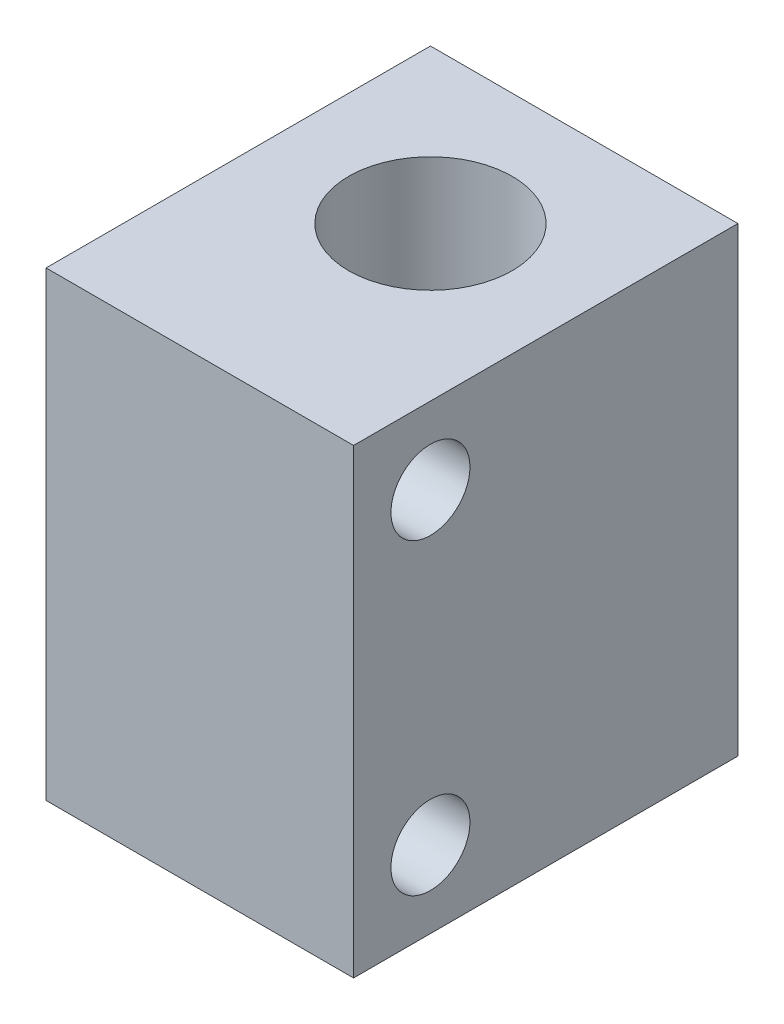
ISO-10303-21;
HEADER;
FILE_DESCRIPTION(('STEP AP214'),'2;1');
FILE_NAME('part.step','',(''),(''),'','','');
FILE_SCHEMA(('AUTOMOTIVE_DESIGN { 1 0 10303 214 1 1 1 1 }'));
ENDSEC;
DATA;
#1=APPLICATION_CONTEXT('core data for automotive mechanical design processes');
#2=APPLICATION_PROTOCOL_DEFINITION('international standard','automotive_design',2000,#1);
#3=PRODUCT_CONTEXT('',#1,'mechanical');
#4=PRODUCT('Part','Part','',(#3));
#5=PRODUCT_RELATED_PRODUCT_CATEGORY('part','',(#4));
#6=PRODUCT_DEFINITION_FORMATION('','',#4);
#7=PRODUCT_DEFINITION_CONTEXT('part definition',#1,'design');
#8=PRODUCT_DEFINITION('design','',#6,#7);
#9=PRODUCT_DEFINITION_SHAPE('','',#8);
#10=(LENGTH_UNIT() NAMED_UNIT(*) SI_UNIT(.MILLI.,.METRE.));
#11=(NAMED_UNIT(*) PLANE_ANGLE_UNIT() SI_UNIT($,.RADIAN.));
#12=(NAMED_UNIT(*) SI_UNIT($,.STERADIAN.) SOLID_ANGLE_UNIT());
#13=UNCERTAINTY_MEASURE_WITH_UNIT(LENGTH_MEASURE(1.E-05),#10,'distance_accuracy_value','');
#14=(GEOMETRIC_REPRESENTATION_CONTEXT(3) GLOBAL_UNCERTAINTY_ASSIGNED_CONTEXT((#13)) GLOBAL_UNIT_ASSIGNED_CONTEXT((#10,
#11,#12)) REPRESENTATION_CONTEXT('',''));
#15=CARTESIAN_POINT('',(0.,0.,0.));
#16=DIRECTION('',(0.,0.,1.));
#17=DIRECTION('',(1.,0.,0.));
#18=AXIS2_PLACEMENT_3D('',#15,#16,#17);
#19=CARTESIAN_POINT('',(6.35,-9.525,15.875));
#20=DIRECTION('',(-1.,0.,0.));
#21=DIRECTION('',(0.,0.,1.));
#22=AXIS2_PLACEMENT_3D('',#19,#20,#21);
#23=PLANE('',#22);
#24=CARTESIAN_POINT('',(6.35,6.35,12.7));
#25=DIRECTION('',(1.,0.,0.));
#26=DIRECTION('',(0.,0.,-1.));
#27=AXIS2_PLACEMENT_3D('',#24,#25,#26);
#28=CIRCLE('',#27,1.63194999999999);
#29=CARTESIAN_POINT('',(6.35,6.35,11.06805));
#30=VERTEX_POINT('',#29);
#31=EDGE_CURVE('E124',#30,#30,#28,.T.);
#32=ORIENTED_EDGE('',*,*,#31,.F.);
#33=EDGE_LOOP('',(#32));
#34=FACE_BOUND('',#33,.T.);
#35=CARTESIAN_POINT('',(6.35,-6.35,12.7));
#36=DIRECTION('',(1.,0.,0.));
#37=DIRECTION('',(0.,0.,-1.));
#38=AXIS2_PLACEMENT_3D('',#35,#36,#37);
#39=CIRCLE('',#38,1.63194999999999);
#40=CARTESIAN_POINT('',(6.35,-6.35,11.06805));
#41=VERTEX_POINT('',#40);
#42=EDGE_CURVE('E118',#41,#41,#39,.T.);
#43=ORIENTED_EDGE('',*,*,#42,.F.);
#44=EDGE_LOOP('',(#43));
#45=FACE_BOUND('',#44,.T.);
#46=DIRECTION('',(0.,1.,0.));
#47=VECTOR('',#46,1.);
#48=CARTESIAN_POINT('',(6.35,-9.525,0.));
#49=LINE('',#48,#47);
#50=CARTESIAN_POINT('',(6.35,-9.525,0.));
#51=VERTEX_POINT('',#50);
#52=CARTESIAN_POINT('',(6.35,9.525,0.));
#53=VERTEX_POINT('',#52);
#54=EDGE_CURVE('E96',#51,#53,#49,.T.);
#55=ORIENTED_EDGE('',*,*,#54,.T.);
#56=DIRECTION('',(0.,0.,-1.));
#57=VECTOR('',#56,1.);
#58=CARTESIAN_POINT('',(6.35,9.525,15.875));
#59=LINE('',#58,#57);
#60=CARTESIAN_POINT('',(6.35,9.525,15.875));
#61=VERTEX_POINT('',#60);
#62=EDGE_CURVE('E11',#61,#53,#59,.T.);
#63=ORIENTED_EDGE('',*,*,#62,.F.);
#64=DIRECTION('',(0.,1.,0.));
#65=VECTOR('',#64,1.);
#66=CARTESIAN_POINT('',(6.35,-9.525,15.875));
#67=LINE('',#66,#65);
#68=CARTESIAN_POINT('',(6.35,-9.525,15.875));
#69=VERTEX_POINT('',#68);
#70=EDGE_CURVE('E84',#69,#61,#67,.T.);
#71=ORIENTED_EDGE('',*,*,#70,.F.);
#72=DIRECTION('',(0.,0.,-1.));
#73=VECTOR('',#72,1.);
#74=CARTESIAN_POINT('',(6.35,-9.525,15.875));
#75=LINE('',#74,#73);
#76=EDGE_CURVE('E92',#69,#51,#75,.T.);
#77=ORIENTED_EDGE('',*,*,#76,.T.);
#78=EDGE_LOOP('',(#55,#63,#71,#77));
#79=FACE_BOUND('',#78,.T.);
#80=ADVANCED_FACE('F33',(#34,#45,#79),#23,.F.);
#81=CARTESIAN_POINT('',(-6.35,9.525,15.875));
#82=DIRECTION('',(0.,-1.,0.));
#83=DIRECTION('',(0.,0.,-1.));
#84=AXIS2_PLACEMENT_3D('',#81,#82,#83);
#85=PLANE('',#84);
#86=CARTESIAN_POINT('',(0.,9.525,6.35));
#87=DIRECTION('',(0.,1.,0.));
#88=DIRECTION('',(0.,0.,1.));
#89=AXIS2_PLACEMENT_3D('',#86,#87,#88);
#90=CIRCLE('',#89,3.37819999999999);
#91=CARTESIAN_POINT('',(0.,9.525,9.72819999999999));
#92=VERTEX_POINT('',#91);
#93=EDGE_CURVE('E112',#92,#92,#90,.T.);
#94=ORIENTED_EDGE('',*,*,#93,.F.);
#95=EDGE_LOOP('',(#94));
#96=FACE_BOUND('',#95,.T.);
#97=DIRECTION('',(-1.,0.,0.));
#98=VECTOR('',#97,1.);
#99=CARTESIAN_POINT('',(-6.35,9.525,0.));
#100=LINE('',#99,#98);
#101=CARTESIAN_POINT('',(-6.35,9.525,0.));
#102=VERTEX_POINT('',#101);
#103=EDGE_CURVE('E88',#53,#102,#100,.T.);
#104=ORIENTED_EDGE('',*,*,#103,.T.);
#105=DIRECTION('',(0.,0.,-1.));
#106=VECTOR('',#105,1.);
#107=CARTESIAN_POINT('',(-6.35,9.525,15.875));
#108=LINE('',#107,#106);
#109=CARTESIAN_POINT('',(-6.35,9.525,15.875));
#110=VERTEX_POINT('',#109);
#111=EDGE_CURVE('E41',#110,#102,#108,.T.);
#112=ORIENTED_EDGE('',*,*,#111,.F.);
#113=DIRECTION('',(-1.,0.,0.));
#114=VECTOR('',#113,1.);
#115=CARTESIAN_POINT('',(-6.35,9.525,15.875));
#116=LINE('',#115,#114);
#117=EDGE_CURVE('E79',#61,#110,#116,.T.);
#118=ORIENTED_EDGE('',*,*,#117,.F.);
#119=ORIENTED_EDGE('',*,*,#62,.T.);
#120=EDGE_LOOP('',(#104,#112,#118,#119));
#121=FACE_BOUND('',#120,.T.);
#122=ADVANCED_FACE('F87',(#96,#121),#85,.F.);
#123=CARTESIAN_POINT('',(-6.35,-9.525,15.875));
#124=DIRECTION('',(1.,0.,0.));
#125=DIRECTION('',(0.,0.,-1.));
#126=AXIS2_PLACEMENT_3D('',#123,#124,#125);
#127=PLANE('',#126);
#128=CARTESIAN_POINT('',(-6.35,6.35,12.7));
#129=DIRECTION('',(1.,0.,0.));
#130=DIRECTION('',(0.,0.,-1.));
#131=AXIS2_PLACEMENT_3D('',#128,#129,#130);
#132=CIRCLE('',#131,1.63195);
#133=CARTESIAN_POINT('',(-6.35,6.35,11.06805));
#134=VERTEX_POINT('',#133);
#135=EDGE_CURVE('E121',#134,#134,#132,.T.);
#136=ORIENTED_EDGE('',*,*,#135,.T.);
#137=EDGE_LOOP('',(#136));
#138=FACE_BOUND('',#137,.T.);
#139=CARTESIAN_POINT('',(-6.35,-6.35,12.7));
#140=DIRECTION('',(1.,0.,0.));
#141=DIRECTION('',(0.,0.,-1.));
#142=AXIS2_PLACEMENT_3D('',#139,#140,#141);
#143=CIRCLE('',#142,1.63195);
#144=CARTESIAN_POINT('',(-6.35,-6.35,11.06805));
#145=VERTEX_POINT('',#144);
#146=EDGE_CURVE('E115',#145,#145,#143,.T.);
#147=ORIENTED_EDGE('',*,*,#146,.T.);
#148=EDGE_LOOP('',(#147));
#149=FACE_BOUND('',#148,.T.);
#150=DIRECTION('',(0.,-1.,0.));
#151=VECTOR('',#150,1.);
#152=CARTESIAN_POINT('',(-6.35,-9.525,0.));
#153=LINE('',#152,#151);
#154=CARTESIAN_POINT('',(-6.35,-9.525,0.));
#155=VERTEX_POINT('',#154);
#156=EDGE_CURVE('E66',#102,#155,#153,.T.);
#157=ORIENTED_EDGE('',*,*,#156,.T.);
#158=DIRECTION('',(0.,0.,-1.));
#159=VECTOR('',#158,1.);
#160=CARTESIAN_POINT('',(-6.35,-9.525,15.875));
#161=LINE('',#160,#159);
#162=CARTESIAN_POINT('',(-6.35,-9.525,15.875));
#163=VERTEX_POINT('',#162);
#164=EDGE_CURVE('E89',#163,#155,#161,.T.);
#165=ORIENTED_EDGE('',*,*,#164,.F.);
#166=DIRECTION('',(0.,-1.,0.));
#167=VECTOR('',#166,1.);
#168=CARTESIAN_POINT('',(-6.35,-9.525,15.875));
#169=LINE('',#168,#167);
#170=EDGE_CURVE('E82',#110,#163,#169,.T.);
#171=ORIENTED_EDGE('',*,*,#170,.F.);
#172=ORIENTED_EDGE('',*,*,#111,.T.);
#173=EDGE_LOOP('',(#157,#165,#171,#172));
#174=FACE_BOUND('',#173,.T.);
#175=ADVANCED_FACE('F90',(#138,#149,#174),#127,.F.);
#176=CARTESIAN_POINT('',(-6.35,-9.525,15.875));
#177=DIRECTION('',(0.,1.,0.));
#178=DIRECTION('',(0.,0.,1.));
#179=AXIS2_PLACEMENT_3D('',#176,#177,#178);
#180=PLANE('',#179);
#181=CARTESIAN_POINT('',(0.,-9.525,6.35));
#182=DIRECTION('',(0.,1.,0.));
#183=DIRECTION('',(0.,0.,1.));
#184=AXIS2_PLACEMENT_3D('',#181,#182,#183);
#185=CIRCLE('',#184,3.37819999999999);
#186=CARTESIAN_POINT('',(0.,-9.525,9.7282));
#187=VERTEX_POINT('',#186);
#188=EDGE_CURVE('E99',#187,#187,#185,.T.);
#189=ORIENTED_EDGE('',*,*,#188,.T.);
#190=EDGE_LOOP('',(#189));
#191=FACE_BOUND('',#190,.T.);
#192=DIRECTION('',(1.,0.,0.));
#193=VECTOR('',#192,1.);
#194=CARTESIAN_POINT('',(-6.35,-9.525,0.));
#195=LINE('',#194,#193);
#196=EDGE_CURVE('E72',#155,#51,#195,.T.);
#197=ORIENTED_EDGE('',*,*,#196,.T.);
#198=ORIENTED_EDGE('',*,*,#76,.F.);
#199=DIRECTION('',(1.,0.,0.));
#200=VECTOR('',#199,1.);
#201=CARTESIAN_POINT('',(-6.35,-9.525,15.875));
#202=LINE('',#201,#200);
#203=EDGE_CURVE('E49',#163,#69,#202,.T.);
#204=ORIENTED_EDGE('',*,*,#203,.F.);
#205=ORIENTED_EDGE('',*,*,#164,.T.);
#206=EDGE_LOOP('',(#197,#198,#204,#205));
#207=FACE_BOUND('',#206,.T.);
#208=ADVANCED_FACE('F104',(#191,#207),#180,.F.);
#209=CARTESIAN_POINT('',(0.,0.,15.875));
#210=DIRECTION('',(0.,0.,-1.));
#211=DIRECTION('',(-1.,0.,0.));
#212=AXIS2_PLACEMENT_3D('',#209,#210,#211);
#213=PLANE('',#212);
#214=ORIENTED_EDGE('',*,*,#70,.T.);
#215=ORIENTED_EDGE('',*,*,#117,.T.);
#216=ORIENTED_EDGE('',*,*,#170,.T.);
#217=ORIENTED_EDGE('',*,*,#203,.T.);
#218=EDGE_LOOP('',(#214,#215,#216,#217));
#219=FACE_BOUND('',#218,.T.);
#220=ADVANCED_FACE('F80',(#219),#213,.F.);
#221=CARTESIAN_POINT('',(0.,0.,0.));
#222=DIRECTION('',(0.,0.,-1.));
#223=DIRECTION('',(-1.,0.,0.));
#224=AXIS2_PLACEMENT_3D('',#221,#222,#223);
#225=PLANE('',#224);
#226=ORIENTED_EDGE('',*,*,#54,.F.);
#227=ORIENTED_EDGE('',*,*,#196,.F.);
#228=ORIENTED_EDGE('',*,*,#156,.F.);
#229=ORIENTED_EDGE('',*,*,#103,.F.);
#230=EDGE_LOOP('',(#226,#227,#228,#229));
#231=FACE_BOUND('',#230,.T.);
#232=ADVANCED_FACE('F107',(#231),#225,.T.);
#233=CARTESIAN_POINT('',(0.,9.525,6.35));
#234=DIRECTION('',(0.,1.,0.));
#235=DIRECTION('',(0.,0.,1.));
#236=AXIS2_PLACEMENT_3D('',#233,#234,#235);
#237=CYLINDRICAL_SURFACE('',#236,3.37819999999999);
#238=ORIENTED_EDGE('',*,*,#188,.F.);
#239=EDGE_LOOP('',(#238));
#240=FACE_BOUND('',#239,.T.);
#241=ORIENTED_EDGE('',*,*,#93,.T.);
#242=EDGE_LOOP('',(#241));
#243=FACE_BOUND('',#242,.T.);
#244=ADVANCED_FACE('F136',(#240,#243),#237,.F.);
#245=CARTESIAN_POINT('',(6.35,-6.35,12.7));
#246=DIRECTION('',(1.,0.,0.));
#247=DIRECTION('',(0.,0.,-1.));
#248=AXIS2_PLACEMENT_3D('',#245,#246,#247);
#249=CYLINDRICAL_SURFACE('',#248,1.63194999999999);
#250=ORIENTED_EDGE('',*,*,#146,.F.);
#251=EDGE_LOOP('',(#250));
#252=FACE_BOUND('',#251,.T.);
#253=ORIENTED_EDGE('',*,*,#42,.T.);
#254=EDGE_LOOP('',(#253));
#255=FACE_BOUND('',#254,.T.);
#256=ADVANCED_FACE('F134',(#252,#255),#249,.F.);
#257=CARTESIAN_POINT('',(6.35,6.35,12.7));
#258=DIRECTION('',(1.,0.,0.));
#259=DIRECTION('',(0.,0.,-1.));
#260=AXIS2_PLACEMENT_3D('',#257,#258,#259);
#261=CYLINDRICAL_SURFACE('',#260,1.63194999999999);
#262=ORIENTED_EDGE('',*,*,#135,.F.);
#263=EDGE_LOOP('',(#262));
#264=FACE_BOUND('',#263,.T.);
#265=ORIENTED_EDGE('',*,*,#31,.T.);
#266=EDGE_LOOP('',(#265));
#267=FACE_BOUND('',#266,.T.);
#268=ADVANCED_FACE('F128',(#264,#267),#261,.F.);
#269=CLOSED_SHELL('',(#80,#122,#175,#208,#220,#232,#244,#256,#268));
#270=MANIFOLD_SOLID_BREP('B2',#269);
#271=ADVANCED_BREP_SHAPE_REPRESENTATION('',(#18,#270),#14);
#272=SHAPE_DEFINITION_REPRESENTATION(#9,#271);
ENDSEC;
END-ISO-10303-21;
